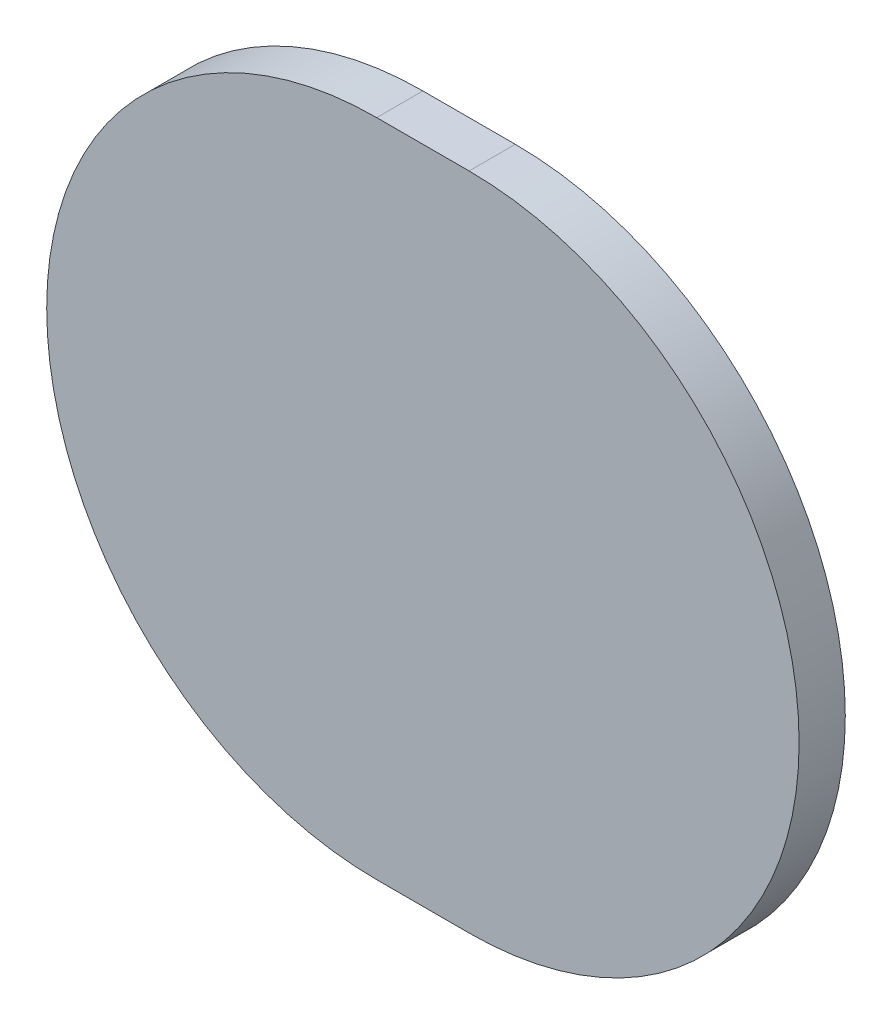
ISO-10303-21;
HEADER;
FILE_DESCRIPTION(('STEP AP214'),'2;1');
FILE_NAME('part.step','',(''),(''),'','','');
FILE_SCHEMA(('AUTOMOTIVE_DESIGN { 1 0 10303 214 1 1 1 1 }'));
ENDSEC;
DATA;
#1=APPLICATION_CONTEXT('core data for automotive mechanical design processes');
#2=APPLICATION_PROTOCOL_DEFINITION('international standard','automotive_design',2000,#1);
#3=PRODUCT_CONTEXT('',#1,'mechanical');
#4=PRODUCT('Part','Part','',(#3));
#5=PRODUCT_RELATED_PRODUCT_CATEGORY('part','',(#4));
#6=PRODUCT_DEFINITION_FORMATION('','',#4);
#7=PRODUCT_DEFINITION_CONTEXT('part definition',#1,'design');
#8=PRODUCT_DEFINITION('design','',#6,#7);
#9=PRODUCT_DEFINITION_SHAPE('','',#8);
#10=(LENGTH_UNIT() NAMED_UNIT(*) SI_UNIT(.MILLI.,.METRE.));
#11=(NAMED_UNIT(*) PLANE_ANGLE_UNIT() SI_UNIT($,.RADIAN.));
#12=(NAMED_UNIT(*) SI_UNIT($,.STERADIAN.) SOLID_ANGLE_UNIT());
#13=UNCERTAINTY_MEASURE_WITH_UNIT(LENGTH_MEASURE(1.E-05),#10,'distance_accuracy_value','');
#14=(GEOMETRIC_REPRESENTATION_CONTEXT(3) GLOBAL_UNCERTAINTY_ASSIGNED_CONTEXT((#13)) GLOBAL_UNIT_ASSIGNED_CONTEXT((#10,
#11,#12)) REPRESENTATION_CONTEXT('',''));
#15=CARTESIAN_POINT('',(0.,0.,0.));
#16=DIRECTION('',(0.,0.,1.));
#17=DIRECTION('',(1.,0.,0.));
#18=AXIS2_PLACEMENT_3D('',#15,#16,#17);
#19=CARTESIAN_POINT('',(78.76,-110.5,1.635));
#20=DIRECTION('',(0.,0.,1.));
#21=DIRECTION('',(1.,0.,0.));
#22=AXIS2_PLACEMENT_3D('',#19,#20,#21);
#23=PLANE('',#22);
#24=DIRECTION('',(-1.,0.,0.));
#25=VECTOR('',#24,1.);
#26=CARTESIAN_POINT('',(78.76,-110.5,1.635));
#27=LINE('',#26,#25);
#28=CARTESIAN_POINT('',(78.76,-110.5,1.635));
#29=VERTEX_POINT('',#28);
#30=CARTESIAN_POINT('',(78.69,-110.5,1.635));
#31=VERTEX_POINT('',#30);
#32=EDGE_CURVE('E83',#29,#31,#27,.T.);
#33=ORIENTED_EDGE('',*,*,#32,.T.);
#34=CARTESIAN_POINT('',(78.69,-110.75,1.635));
#35=DIRECTION('',(0.,0.,1.));
#36=DIRECTION('',(0.,1.,0.));
#37=AXIS2_PLACEMENT_3D('',#34,#35,#36);
#38=CIRCLE('',#37,0.25);
#39=CARTESIAN_POINT('',(78.69,-111.,1.635));
#40=VERTEX_POINT('',#39);
#41=EDGE_CURVE('E81',#31,#40,#38,.T.);
#42=ORIENTED_EDGE('',*,*,#41,.T.);
#43=DIRECTION('',(1.,0.,0.));
#44=VECTOR('',#43,1.);
#45=CARTESIAN_POINT('',(78.69,-111.,1.635));
#46=LINE('',#45,#44);
#47=CARTESIAN_POINT('',(78.76,-111.,1.635));
#48=VERTEX_POINT('',#47);
#49=EDGE_CURVE('E20',#40,#48,#46,.T.);
#50=ORIENTED_EDGE('',*,*,#49,.T.);
#51=CARTESIAN_POINT('',(78.76,-110.75,1.635));
#52=DIRECTION('',(0.,0.,1.));
#53=DIRECTION('',(0.,-1.,0.));
#54=AXIS2_PLACEMENT_3D('',#51,#52,#53);
#55=CIRCLE('',#54,0.25);
#56=EDGE_CURVE('E11',#48,#29,#55,.T.);
#57=ORIENTED_EDGE('',*,*,#56,.T.);
#58=EDGE_LOOP('',(#33,#42,#50,#57));
#59=FACE_BOUND('',#58,.T.);
#60=ADVANCED_FACE('F17',(#59),#23,.T.);
#61=CARTESIAN_POINT('',(78.76,-110.5,1.6));
#62=DIRECTION('',(0.,0.,1.));
#63=DIRECTION('',(1.,0.,0.));
#64=AXIS2_PLACEMENT_3D('',#61,#62,#63);
#65=PLANE('',#64);
#66=CARTESIAN_POINT('',(78.76,-110.75,1.6));
#67=DIRECTION('',(0.,0.,1.));
#68=DIRECTION('',(0.,-1.,0.));
#69=AXIS2_PLACEMENT_3D('',#66,#67,#68);
#70=CIRCLE('',#69,0.25);
#71=CARTESIAN_POINT('',(78.76,-111.,1.6));
#72=VERTEX_POINT('',#71);
#73=CARTESIAN_POINT('',(78.76,-110.5,1.6));
#74=VERTEX_POINT('',#73);
#75=EDGE_CURVE('E27',#72,#74,#70,.T.);
#76=ORIENTED_EDGE('',*,*,#75,.F.);
#77=DIRECTION('',(1.,0.,0.));
#78=VECTOR('',#77,1.);
#79=CARTESIAN_POINT('',(78.69,-111.,1.6));
#80=LINE('',#79,#78);
#81=CARTESIAN_POINT('',(78.69,-111.,1.6));
#82=VERTEX_POINT('',#81);
#83=EDGE_CURVE('E65',#82,#72,#80,.T.);
#84=ORIENTED_EDGE('',*,*,#83,.F.);
#85=CARTESIAN_POINT('',(78.69,-110.75,1.6));
#86=DIRECTION('',(0.,0.,1.));
#87=DIRECTION('',(0.,1.,0.));
#88=AXIS2_PLACEMENT_3D('',#85,#86,#87);
#89=CIRCLE('',#88,0.25);
#90=CARTESIAN_POINT('',(78.69,-110.5,1.6));
#91=VERTEX_POINT('',#90);
#92=EDGE_CURVE('E90',#91,#82,#89,.T.);
#93=ORIENTED_EDGE('',*,*,#92,.F.);
#94=DIRECTION('',(-1.,0.,0.));
#95=VECTOR('',#94,1.);
#96=CARTESIAN_POINT('',(78.76,-110.5,1.6));
#97=LINE('',#96,#95);
#98=EDGE_CURVE('E140',#74,#91,#97,.T.);
#99=ORIENTED_EDGE('',*,*,#98,.F.);
#100=EDGE_LOOP('',(#76,#84,#93,#99));
#101=FACE_BOUND('',#100,.T.);
#102=ADVANCED_FACE('F157',(#101),#65,.F.);
#103=CARTESIAN_POINT('',(78.76,-110.75,1.6));
#104=DIRECTION('',(0.,0.,-1.));
#105=DIRECTION('',(0.,-1.,0.));
#106=AXIS2_PLACEMENT_3D('',#103,#104,#105);
#107=CYLINDRICAL_SURFACE('',#106,0.25);
#108=ORIENTED_EDGE('',*,*,#75,.T.);
#109=DIRECTION('',(0.,0.,1.));
#110=VECTOR('',#109,1.);
#111=CARTESIAN_POINT('',(78.76,-110.5,1.6));
#112=LINE('',#111,#110);
#113=EDGE_CURVE('E97',#74,#29,#112,.T.);
#114=ORIENTED_EDGE('',*,*,#113,.T.);
#115=ORIENTED_EDGE('',*,*,#56,.F.);
#116=DIRECTION('',(0.,0.,1.));
#117=VECTOR('',#116,1.);
#118=CARTESIAN_POINT('',(78.76,-111.,1.6));
#119=LINE('',#118,#117);
#120=EDGE_CURVE('E77',#72,#48,#119,.T.);
#121=ORIENTED_EDGE('',*,*,#120,.F.);
#122=EDGE_LOOP('',(#108,#114,#115,#121));
#123=FACE_BOUND('',#122,.T.);
#124=ADVANCED_FACE('F153',(#123),#107,.T.);
#125=CARTESIAN_POINT('',(78.69,-111.,1.6));
#126=DIRECTION('',(0.,1.,0.));
#127=DIRECTION('',(1.,0.,0.));
#128=AXIS2_PLACEMENT_3D('',#125,#126,#127);
#129=PLANE('',#128);
#130=ORIENTED_EDGE('',*,*,#83,.T.);
#131=ORIENTED_EDGE('',*,*,#120,.T.);
#132=ORIENTED_EDGE('',*,*,#49,.F.);
#133=DIRECTION('',(0.,0.,1.));
#134=VECTOR('',#133,1.);
#135=CARTESIAN_POINT('',(78.69,-111.,1.6));
#136=LINE('',#135,#134);
#137=EDGE_CURVE('E75',#82,#40,#136,.T.);
#138=ORIENTED_EDGE('',*,*,#137,.F.);
#139=EDGE_LOOP('',(#130,#131,#132,#138));
#140=FACE_BOUND('',#139,.T.);
#141=ADVANCED_FACE('F73',(#140),#129,.F.);
#142=CARTESIAN_POINT('',(78.69,-110.75,1.6));
#143=DIRECTION('',(0.,0.,-1.));
#144=DIRECTION('',(0.,1.,0.));
#145=AXIS2_PLACEMENT_3D('',#142,#143,#144);
#146=CYLINDRICAL_SURFACE('',#145,0.25);
#147=ORIENTED_EDGE('',*,*,#92,.T.);
#148=ORIENTED_EDGE('',*,*,#137,.T.);
#149=ORIENTED_EDGE('',*,*,#41,.F.);
#150=DIRECTION('',(0.,0.,1.));
#151=VECTOR('',#150,1.);
#152=CARTESIAN_POINT('',(78.69,-110.5,1.6));
#153=LINE('',#152,#151);
#154=EDGE_CURVE('E134',#91,#31,#153,.T.);
#155=ORIENTED_EDGE('',*,*,#154,.F.);
#156=EDGE_LOOP('',(#147,#148,#149,#155));
#157=FACE_BOUND('',#156,.T.);
#158=ADVANCED_FACE('F89',(#157),#146,.T.);
#159=CARTESIAN_POINT('',(78.76,-110.5,1.6));
#160=DIRECTION('',(0.,-1.,0.));
#161=DIRECTION('',(0.,0.,-1.));
#162=AXIS2_PLACEMENT_3D('',#159,#160,#161);
#163=PLANE('',#162);
#164=ORIENTED_EDGE('',*,*,#98,.T.);
#165=ORIENTED_EDGE('',*,*,#154,.T.);
#166=ORIENTED_EDGE('',*,*,#32,.F.);
#167=ORIENTED_EDGE('',*,*,#113,.F.);
#168=EDGE_LOOP('',(#164,#165,#166,#167));
#169=FACE_BOUND('',#168,.T.);
#170=ADVANCED_FACE('F156',(#169),#163,.F.);
#171=CLOSED_SHELL('',(#60,#102,#124,#141,#158,#170));
#172=MANIFOLD_SOLID_BREP('B1',#171);
#173=ADVANCED_BREP_SHAPE_REPRESENTATION('',(#18,#172),#14);
#174=SHAPE_DEFINITION_REPRESENTATION(#9,#173);
ENDSEC;
END-ISO-10303-21;
